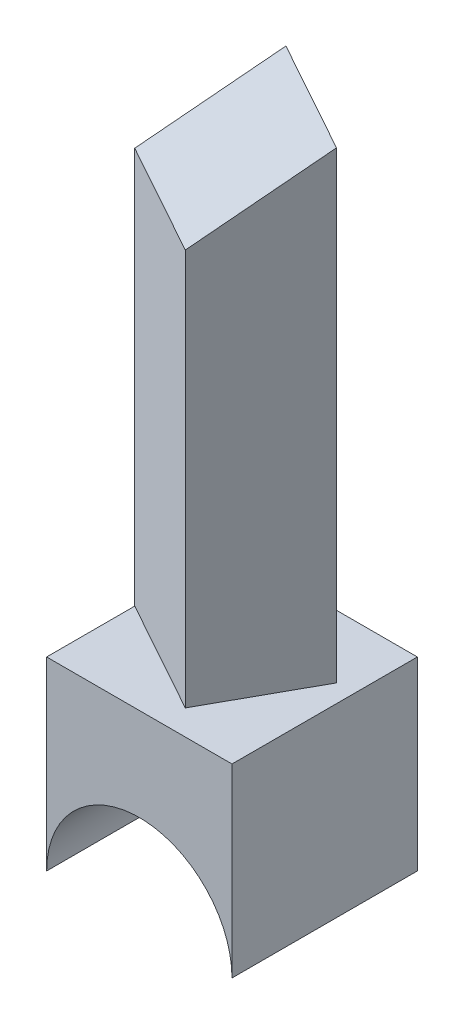
ISO-10303-21;
HEADER;
FILE_DESCRIPTION(('STEP AP214'),'2;1');
FILE_NAME('part.step','',(''),(''),'','','');
FILE_SCHEMA(('AUTOMOTIVE_DESIGN { 1 0 10303 214 1 1 1 1 }'));
ENDSEC;
DATA;
#1=APPLICATION_CONTEXT('core data for automotive mechanical design processes');
#2=APPLICATION_PROTOCOL_DEFINITION('international standard','automotive_design',2000,#1);
#3=PRODUCT_CONTEXT('',#1,'mechanical');
#4=PRODUCT('Part','Part','',(#3));
#5=PRODUCT_RELATED_PRODUCT_CATEGORY('part','',(#4));
#6=PRODUCT_DEFINITION_FORMATION('','',#4);
#7=PRODUCT_DEFINITION_CONTEXT('part definition',#1,'design');
#8=PRODUCT_DEFINITION('design','',#6,#7);
#9=PRODUCT_DEFINITION_SHAPE('','',#8);
#10=(LENGTH_UNIT() NAMED_UNIT(*) SI_UNIT(.MILLI.,.METRE.));
#11=(NAMED_UNIT(*) PLANE_ANGLE_UNIT() SI_UNIT($,.RADIAN.));
#12=(NAMED_UNIT(*) SI_UNIT($,.STERADIAN.) SOLID_ANGLE_UNIT());
#13=UNCERTAINTY_MEASURE_WITH_UNIT(LENGTH_MEASURE(1.E-05),#10,'distance_accuracy_value','');
#14=(GEOMETRIC_REPRESENTATION_CONTEXT(3) GLOBAL_UNCERTAINTY_ASSIGNED_CONTEXT((#13)) GLOBAL_UNIT_ASSIGNED_CONTEXT((#10,
#11,#12)) REPRESENTATION_CONTEXT('',''));
#15=CARTESIAN_POINT('',(0.,0.,0.));
#16=DIRECTION('',(0.,0.,1.));
#17=DIRECTION('',(1.,0.,0.));
#18=AXIS2_PLACEMENT_3D('',#15,#16,#17);
#19=CARTESIAN_POINT('',(-50.,50.,100.));
#20=DIRECTION('',(0.,-1.,0.));
#21=DIRECTION('',(0.,0.,-1.));
#22=AXIS2_PLACEMENT_3D('',#19,#20,#21);
#23=PLANE('',#22);
#24=DIRECTION('',(0.484809620246331,0.,-0.874619707139399));
#25=VECTOR('',#24,1.);
#26=CARTESIAN_POINT('',(40.3119567145378,50.,33.9366734172432));
#27=LINE('',#26,#25);
#28=CARTESIAN_POINT('',(11.223379499758,50.,86.4138558456071));
#29=VERTEX_POINT('',#28);
#30=CARTESIAN_POINT('',(40.3119567145378,50.,33.9366734172432));
#31=VERTEX_POINT('',#30);
#32=EDGE_CURVE('E125',#29,#31,#27,.T.);
#33=ORIENTED_EDGE('',*,*,#32,.F.);
#34=DIRECTION('',(0.874619707139399,0.,0.484809620246331));
#35=VECTOR('',#34,1.);
#36=CARTESIAN_POINT('',(11.223379499758,50.,86.4138558456071));
#37=LINE('',#36,#35);
#38=CARTESIAN_POINT('',(-50.,50.,52.477182428364));
#39=VERTEX_POINT('',#38);
#40=EDGE_CURVE('E196',#39,#29,#37,.T.);
#41=ORIENTED_EDGE('',*,*,#40,.F.);
#42=DIRECTION('',(0.,0.,-1.));
#43=VECTOR('',#42,1.);
#44=CARTESIAN_POINT('',(-50.,50.,100.));
#45=LINE('',#44,#43);
#46=CARTESIAN_POINT('',(-50.,50.,100.));
#47=VERTEX_POINT('',#46);
#48=EDGE_CURVE('E175',#47,#39,#45,.T.);
#49=ORIENTED_EDGE('',*,*,#48,.F.);
#50=DIRECTION('',(-1.,0.,0.));
#51=VECTOR('',#50,1.);
#52=CARTESIAN_POINT('',(-50.,50.,100.));
#53=LINE('',#52,#51);
#54=CARTESIAN_POINT('',(50.,50.,100.));
#55=VERTEX_POINT('',#54);
#56=EDGE_CURVE('E152',#55,#47,#53,.T.);
#57=ORIENTED_EDGE('',*,*,#56,.F.);
#58=DIRECTION('',(0.,0.,-1.));
#59=VECTOR('',#58,1.);
#60=CARTESIAN_POINT('',(50.,50.,100.));
#61=LINE('',#60,#59);
#62=CARTESIAN_POINT('',(50.,50.,0.));
#63=VERTEX_POINT('',#62);
#64=EDGE_CURVE('E48',#55,#63,#61,.T.);
#65=ORIENTED_EDGE('',*,*,#64,.T.);
#66=DIRECTION('',(-1.,0.,0.));
#67=VECTOR('',#66,1.);
#68=CARTESIAN_POINT('',(-50.,50.,0.));
#69=LINE('',#68,#67);
#70=CARTESIAN_POINT('',(-20.9114227852201,50.,0.));
#71=VERTEX_POINT('',#70);
#72=EDGE_CURVE('E166',#63,#71,#69,.T.);
#73=ORIENTED_EDGE('',*,*,#72,.T.);
#74=DIRECTION('',(-0.874619707139399,0.,-0.484809620246332));
#75=VECTOR('',#74,1.);
#76=CARTESIAN_POINT('',(-20.9114227852201,50.,0.));
#77=LINE('',#76,#75);
#78=EDGE_CURVE('E62',#31,#71,#77,.T.);
#79=ORIENTED_EDGE('',*,*,#78,.F.);
#80=EDGE_LOOP('',(#33,#41,#49,#57,#65,#73,#79));
#81=FACE_BOUND('',#80,.T.);
#82=ADVANCED_FACE('F39',(#81),#23,.F.);
#83=DIRECTION('',(-0.484809620246331,0.,0.874619707139399));
#84=VECTOR('',#83,1.);
#85=CARTESIAN_POINT('',(-20.9114227852201,50.,0.));
#86=LINE('',#85,#84);
#87=EDGE_CURVE('E130',#71,#39,#86,.T.);
#88=ORIENTED_EDGE('',*,*,#87,.F.);
#89=CARTESIAN_POINT('',(-50.,50.,0.));
#90=VERTEX_POINT('',#89);
#91=EDGE_CURVE('E165',#71,#90,#69,.T.);
#92=ORIENTED_EDGE('',*,*,#91,.T.);
#93=EDGE_CURVE('E174',#39,#90,#45,.T.);
#94=ORIENTED_EDGE('',*,*,#93,.F.);
#95=EDGE_LOOP('',(#88,#92,#94));
#96=FACE_BOUND('',#95,.T.);
#97=ADVANCED_FACE('F194',(#96),#23,.F.);
#98=CARTESIAN_POINT('',(0.,-50.,100.));
#99=DIRECTION('',(0.,0.,-1.));
#100=DIRECTION('',(-1.,0.,0.));
#101=AXIS2_PLACEMENT_3D('',#98,#99,#100);
#102=CYLINDRICAL_SURFACE('',#101,50.);
#103=CARTESIAN_POINT('',(0.,-50.,0.));
#104=DIRECTION('',(0.,0.,-1.));
#105=DIRECTION('',(1.,0.,0.));
#106=AXIS2_PLACEMENT_3D('',#103,#104,#105);
#107=CIRCLE('',#106,50.);
#108=CARTESIAN_POINT('',(-50.,-50.,0.));
#109=VERTEX_POINT('',#108);
#110=CARTESIAN_POINT('',(50.,-50.,0.));
#111=VERTEX_POINT('',#110);
#112=EDGE_CURVE('E143',#109,#111,#107,.T.);
#113=ORIENTED_EDGE('',*,*,#112,.T.);
#114=DIRECTION('',(0.,0.,-1.));
#115=VECTOR('',#114,1.);
#116=CARTESIAN_POINT('',(50.,-50.,100.));
#117=LINE('',#116,#115);
#118=CARTESIAN_POINT('',(50.,-50.,100.));
#119=VERTEX_POINT('',#118);
#120=EDGE_CURVE('E11',#119,#111,#117,.T.);
#121=ORIENTED_EDGE('',*,*,#120,.F.);
#122=CARTESIAN_POINT('',(0.,-50.,100.));
#123=DIRECTION('',(0.,0.,-1.));
#124=DIRECTION('',(1.,0.,0.));
#125=AXIS2_PLACEMENT_3D('',#122,#123,#124);
#126=CIRCLE('',#125,50.);
#127=CARTESIAN_POINT('',(-50.,-50.,100.));
#128=VERTEX_POINT('',#127);
#129=EDGE_CURVE('E144',#128,#119,#126,.T.);
#130=ORIENTED_EDGE('',*,*,#129,.F.);
#131=DIRECTION('',(0.,0.,-1.));
#132=VECTOR('',#131,1.);
#133=CARTESIAN_POINT('',(-50.,-50.,100.));
#134=LINE('',#133,#132);
#135=EDGE_CURVE('E158',#128,#109,#134,.T.);
#136=ORIENTED_EDGE('',*,*,#135,.T.);
#137=EDGE_LOOP('',(#113,#121,#130,#136));
#138=FACE_BOUND('',#137,.T.);
#139=ADVANCED_FACE('F41',(#138),#102,.F.);
#140=CARTESIAN_POINT('',(50.,50.,100.));
#141=DIRECTION('',(-1.,0.,0.));
#142=DIRECTION('',(0.,-1.,0.));
#143=AXIS2_PLACEMENT_3D('',#140,#141,#142);
#144=PLANE('',#143);
#145=DIRECTION('',(0.,1.,0.));
#146=VECTOR('',#145,1.);
#147=CARTESIAN_POINT('',(50.,50.,0.));
#148=LINE('',#147,#146);
#149=EDGE_CURVE('E162',#111,#63,#148,.T.);
#150=ORIENTED_EDGE('',*,*,#149,.T.);
#151=ORIENTED_EDGE('',*,*,#64,.F.);
#152=DIRECTION('',(0.,1.,0.));
#153=VECTOR('',#152,1.);
#154=CARTESIAN_POINT('',(50.,50.,100.));
#155=LINE('',#154,#153);
#156=EDGE_CURVE('E148',#119,#55,#155,.T.);
#157=ORIENTED_EDGE('',*,*,#156,.F.);
#158=ORIENTED_EDGE('',*,*,#120,.T.);
#159=EDGE_LOOP('',(#150,#151,#157,#158));
#160=FACE_BOUND('',#159,.T.);
#161=ADVANCED_FACE('F219',(#160),#144,.F.);
#162=CARTESIAN_POINT('',(-50.,50.,100.));
#163=DIRECTION('',(1.,0.,0.));
#164=DIRECTION('',(0.,1.,0.));
#165=AXIS2_PLACEMENT_3D('',#162,#163,#164);
#166=PLANE('',#165);
#167=DIRECTION('',(0.,-1.,0.));
#168=VECTOR('',#167,1.);
#169=CARTESIAN_POINT('',(-50.,50.,0.));
#170=LINE('',#169,#168);
#171=EDGE_CURVE('E149',#90,#109,#170,.T.);
#172=ORIENTED_EDGE('',*,*,#171,.T.);
#173=ORIENTED_EDGE('',*,*,#135,.F.);
#174=DIRECTION('',(0.,-1.,0.));
#175=VECTOR('',#174,1.);
#176=CARTESIAN_POINT('',(-50.,50.,100.));
#177=LINE('',#176,#175);
#178=EDGE_CURVE('E155',#47,#128,#177,.T.);
#179=ORIENTED_EDGE('',*,*,#178,.F.);
#180=ORIENTED_EDGE('',*,*,#48,.T.);
#181=ORIENTED_EDGE('',*,*,#93,.T.);
#182=EDGE_LOOP('',(#172,#173,#179,#180,#181));
#183=FACE_BOUND('',#182,.T.);
#184=ADVANCED_FACE('F214',(#183),#166,.F.);
#185=CARTESIAN_POINT('',(0.,-50.,100.));
#186=DIRECTION('',(0.,0.,1.));
#187=DIRECTION('',(1.,0.,0.));
#188=AXIS2_PLACEMENT_3D('',#185,#186,#187);
#189=PLANE('',#188);
#190=ORIENTED_EDGE('',*,*,#129,.T.);
#191=ORIENTED_EDGE('',*,*,#156,.T.);
#192=ORIENTED_EDGE('',*,*,#56,.T.);
#193=ORIENTED_EDGE('',*,*,#178,.T.);
#194=EDGE_LOOP('',(#190,#191,#192,#193));
#195=FACE_BOUND('',#194,.T.);
#196=ADVANCED_FACE('F217',(#195),#189,.T.);
#197=CARTESIAN_POINT('',(0.,-50.,0.));
#198=DIRECTION('',(0.,0.,1.));
#199=DIRECTION('',(1.,0.,0.));
#200=AXIS2_PLACEMENT_3D('',#197,#198,#199);
#201=PLANE('',#200);
#202=ORIENTED_EDGE('',*,*,#112,.F.);
#203=ORIENTED_EDGE('',*,*,#171,.F.);
#204=ORIENTED_EDGE('',*,*,#91,.F.);
#205=ORIENTED_EDGE('',*,*,#72,.F.);
#206=ORIENTED_EDGE('',*,*,#149,.F.);
#207=EDGE_LOOP('',(#202,#203,#204,#205,#206));
#208=FACE_BOUND('',#207,.T.);
#209=ADVANCED_FACE('F188',(#208),#201,.F.);
#210=CARTESIAN_POINT('',(40.3119567145378,300.,33.9366734172432));
#211=DIRECTION('',(-0.874619707139399,0.,-0.484809620246331));
#212=DIRECTION('',(-0.484809620246331,0.,0.874619707139399));
#213=AXIS2_PLACEMENT_3D('',#210,#211,#212);
#214=PLANE('',#213);
#215=DIRECTION('',(0.,-1.,0.));
#216=VECTOR('',#215,1.);
#217=CARTESIAN_POINT('',(40.3119567145378,300.,33.9366734172432));
#218=LINE('',#217,#216);
#219=CARTESIAN_POINT('',(40.3119567145378,300.,33.9366734172432));
#220=VERTEX_POINT('',#219);
#221=EDGE_CURVE('E136',#220,#31,#218,.T.);
#222=ORIENTED_EDGE('',*,*,#221,.F.);
#223=DIRECTION('',(0.415562953540966,0.515038074910049,-0.749695413509553));
#224=VECTOR('',#223,1.);
#225=CARTESIAN_POINT('',(40.3119567145378,300.,33.9366734172431));
#226=LINE('',#225,#224);
#227=CARTESIAN_POINT('',(11.2233794997579,263.948362858347,86.4138558456071));
#228=VERTEX_POINT('',#227);
#229=EDGE_CURVE('E117',#228,#220,#226,.T.);
#230=ORIENTED_EDGE('',*,*,#229,.F.);
#231=DIRECTION('',(0.,-1.,0.));
#232=VECTOR('',#231,1.);
#233=CARTESIAN_POINT('',(11.223379499758,300.,86.4138558456071));
#234=LINE('',#233,#232);
#235=EDGE_CURVE('E55',#228,#29,#234,.T.);
#236=ORIENTED_EDGE('',*,*,#235,.T.);
#237=ORIENTED_EDGE('',*,*,#32,.T.);
#238=EDGE_LOOP('',(#222,#230,#236,#237));
#239=FACE_BOUND('',#238,.T.);
#240=ADVANCED_FACE('F210',(#239),#214,.F.);
#241=CARTESIAN_POINT('',(-20.9114227852201,300.,0.));
#242=DIRECTION('',(-0.484809620246332,0.,0.874619707139399));
#243=DIRECTION('',(0.874619707139399,0.,0.484809620246332));
#244=AXIS2_PLACEMENT_3D('',#241,#242,#243);
#245=PLANE('',#244);
#246=ORIENTED_EDGE('',*,*,#78,.T.);
#247=DIRECTION('',(0.,-1.,0.));
#248=VECTOR('',#247,1.);
#249=CARTESIAN_POINT('',(-20.9114227852201,300.,0.));
#250=LINE('',#249,#248);
#251=CARTESIAN_POINT('',(-20.9114227852201,300.,0.));
#252=VERTEX_POINT('',#251);
#253=EDGE_CURVE('E132',#252,#71,#250,.T.);
#254=ORIENTED_EDGE('',*,*,#253,.F.);
#255=DIRECTION('',(-0.874619707139399,0.,-0.484809620246332));
#256=VECTOR('',#255,1.);
#257=CARTESIAN_POINT('',(-20.9114227852201,300.,0.));
#258=LINE('',#257,#256);
#259=EDGE_CURVE('E111',#220,#252,#258,.T.);
#260=ORIENTED_EDGE('',*,*,#259,.F.);
#261=ORIENTED_EDGE('',*,*,#221,.T.);
#262=EDGE_LOOP('',(#246,#254,#260,#261));
#263=FACE_BOUND('',#262,.T.);
#264=ADVANCED_FACE('F199',(#263),#245,.F.);
#265=CARTESIAN_POINT('',(-20.9114227852201,300.,0.));
#266=DIRECTION('',(0.874619707139399,0.,0.484809620246331));
#267=DIRECTION('',(0.484809620246331,0.,-0.874619707139399));
#268=AXIS2_PLACEMENT_3D('',#265,#266,#267);
#269=PLANE('',#268);
#270=DIRECTION('',(0.,-1.,0.));
#271=VECTOR('',#270,1.);
#272=CARTESIAN_POINT('',(-50.,300.,52.4771824283639));
#273=LINE('',#272,#271);
#274=CARTESIAN_POINT('',(-50.,263.948362858347,52.4771824283638));
#275=VERTEX_POINT('',#274);
#276=EDGE_CURVE('E122',#275,#39,#273,.T.);
#277=ORIENTED_EDGE('',*,*,#276,.F.);
#278=DIRECTION('',(0.415562953540966,0.515038074910049,-0.749695413509553));
#279=VECTOR('',#278,1.);
#280=CARTESIAN_POINT('',(-20.9114227852201,300.,0.));
#281=LINE('',#280,#279);
#282=EDGE_CURVE('E106',#275,#252,#281,.T.);
#283=ORIENTED_EDGE('',*,*,#282,.T.);
#284=ORIENTED_EDGE('',*,*,#253,.T.);
#285=ORIENTED_EDGE('',*,*,#87,.T.);
#286=EDGE_LOOP('',(#277,#283,#284,#285));
#287=FACE_BOUND('',#286,.T.);
#288=ADVANCED_FACE('F128',(#287),#269,.F.);
#289=CARTESIAN_POINT('',(11.223379499758,300.,86.4138558456071));
#290=DIRECTION('',(0.484809620246331,0.,-0.874619707139399));
#291=DIRECTION('',(-0.874619707139399,0.,-0.484809620246331));
#292=AXIS2_PLACEMENT_3D('',#289,#290,#291);
#293=PLANE('',#292);
#294=ORIENTED_EDGE('',*,*,#235,.F.);
#295=DIRECTION('',(0.874619707139399,0.,0.484809620246332));
#296=VECTOR('',#295,1.);
#297=CARTESIAN_POINT('',(-50.,263.948362858347,52.4771824283638));
#298=LINE('',#297,#296);
#299=EDGE_CURVE('E109',#275,#228,#298,.T.);
#300=ORIENTED_EDGE('',*,*,#299,.F.);
#301=ORIENTED_EDGE('',*,*,#276,.T.);
#302=ORIENTED_EDGE('',*,*,#40,.T.);
#303=EDGE_LOOP('',(#294,#300,#301,#302));
#304=FACE_BOUND('',#303,.T.);
#305=ADVANCED_FACE('F120',(#304),#293,.F.);
#306=CARTESIAN_POINT('',(-20.9114227852201,300.,0.));
#307=DIRECTION('',(0.249695413509543,-0.857167300702115,-0.450462450243467));
#308=DIRECTION('',(0.,0.465197857857139,-0.885206728987714));
#309=AXIS2_PLACEMENT_3D('',#306,#307,#308);
#310=PLANE('',#309);
#311=ORIENTED_EDGE('',*,*,#229,.T.);
#312=ORIENTED_EDGE('',*,*,#259,.T.);
#313=ORIENTED_EDGE('',*,*,#282,.F.);
#314=ORIENTED_EDGE('',*,*,#299,.T.);
#315=EDGE_LOOP('',(#311,#312,#313,#314));
#316=FACE_BOUND('',#315,.T.);
#317=ADVANCED_FACE('F108',(#316),#310,.F.);
#318=CLOSED_SHELL('',(#82,#97,#139,#161,#184,#196,#209,#240,#264,#288,#305,#317));
#319=MANIFOLD_SOLID_BREP('B2',#318);
#320=ADVANCED_BREP_SHAPE_REPRESENTATION('',(#18,#319),#14);
#321=SHAPE_DEFINITION_REPRESENTATION(#9,#320);
ENDSEC;
END-ISO-10303-21;
